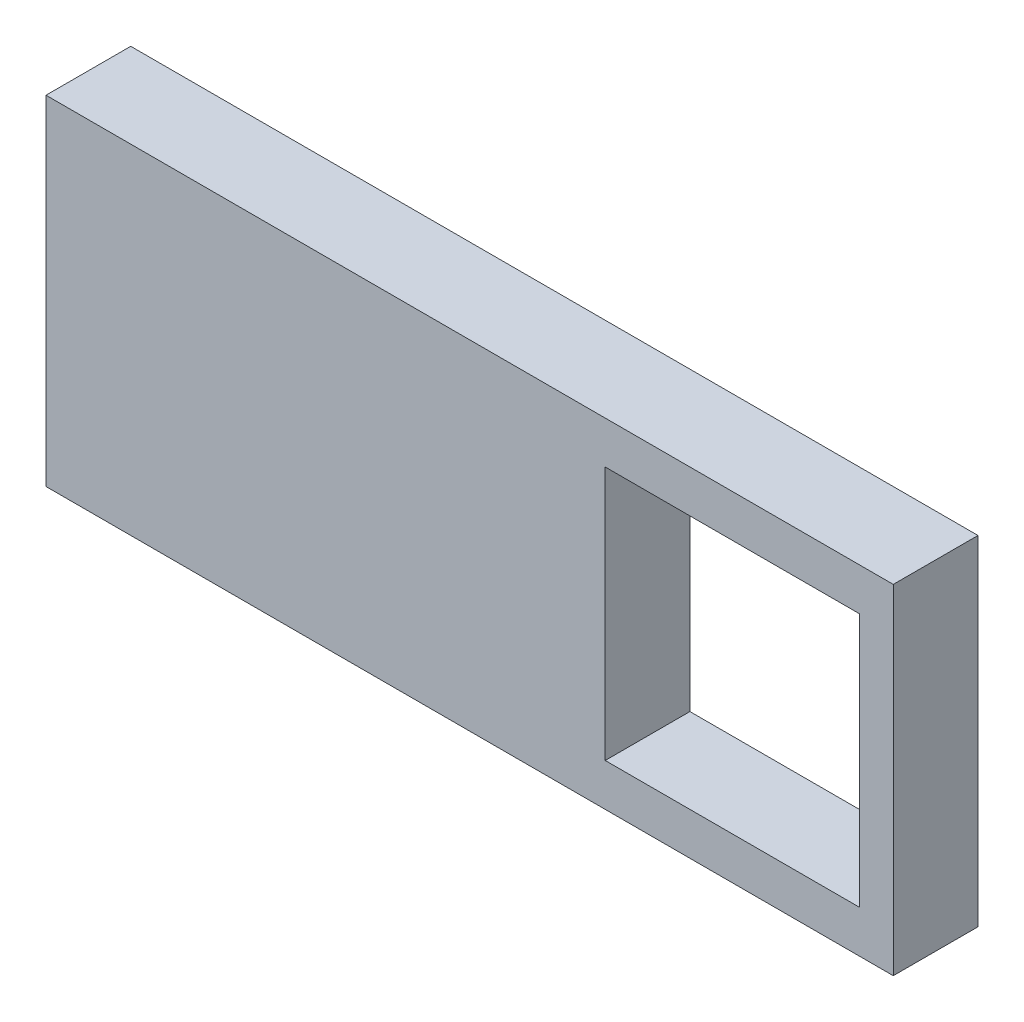
ISO-10303-21;
HEADER;
FILE_DESCRIPTION(('STEP AP214'),'2;1');
FILE_NAME('part.step','',(''),(''),'','','');
FILE_SCHEMA(('AUTOMOTIVE_DESIGN { 1 0 10303 214 1 1 1 1 }'));
ENDSEC;
DATA;
#1=APPLICATION_CONTEXT('core data for automotive mechanical design processes');
#2=APPLICATION_PROTOCOL_DEFINITION('international standard','automotive_design',2000,#1);
#3=PRODUCT_CONTEXT('',#1,'mechanical');
#4=PRODUCT('Part','Part','',(#3));
#5=PRODUCT_RELATED_PRODUCT_CATEGORY('part','',(#4));
#6=PRODUCT_DEFINITION_FORMATION('','',#4);
#7=PRODUCT_DEFINITION_CONTEXT('part definition',#1,'design');
#8=PRODUCT_DEFINITION('design','',#6,#7);
#9=PRODUCT_DEFINITION_SHAPE('','',#8);
#10=(LENGTH_UNIT() NAMED_UNIT(*) SI_UNIT(.MILLI.,.METRE.));
#11=(NAMED_UNIT(*) PLANE_ANGLE_UNIT() SI_UNIT($,.RADIAN.));
#12=(NAMED_UNIT(*) SI_UNIT($,.STERADIAN.) SOLID_ANGLE_UNIT());
#13=UNCERTAINTY_MEASURE_WITH_UNIT(LENGTH_MEASURE(1.E-05),#10,'distance_accuracy_value','');
#14=(GEOMETRIC_REPRESENTATION_CONTEXT(3) GLOBAL_UNCERTAINTY_ASSIGNED_CONTEXT((#13)) GLOBAL_UNIT_ASSIGNED_CONTEXT((#10,
#11,#12)) REPRESENTATION_CONTEXT('',''));
#15=CARTESIAN_POINT('',(0.,0.,0.));
#16=DIRECTION('',(0.,0.,1.));
#17=DIRECTION('',(1.,0.,0.));
#18=AXIS2_PLACEMENT_3D('',#15,#16,#17);
#19=CARTESIAN_POINT('',(-0.06999999832362,-0.07499999832362,0.3));
#20=DIRECTION('',(1.,0.,0.));
#21=DIRECTION('',(0.,1.,0.));
#22=AXIS2_PLACEMENT_3D('',#19,#20,#21);
#23=PLANE('',#22);
#24=DIRECTION('',(0.,1.,0.));
#25=VECTOR('',#24,1.);
#26=CARTESIAN_POINT('',(-0.06999999832362,-0.07499999832362,0.3));
#27=LINE('',#26,#25);
#28=CARTESIAN_POINT('',(-0.06999999832362,-0.07499999832362,0.3));
#29=VERTEX_POINT('',#28);
#30=CARTESIAN_POINT('',(-0.06999999832362,0.07499999832362,0.3));
#31=VERTEX_POINT('',#30);
#32=EDGE_CURVE('E144',#29,#31,#27,.T.);
#33=ORIENTED_EDGE('',*,*,#32,.T.);
#34=DIRECTION('',(0.,0.,1.));
#35=VECTOR('',#34,1.);
#36=CARTESIAN_POINT('',(-0.06999999832362,0.07499999832362,0.3));
#37=LINE('',#36,#35);
#38=CARTESIAN_POINT('',(-0.06999999832362,0.07499999832362,0.35));
#39=VERTEX_POINT('',#38);
#40=EDGE_CURVE('E95',#31,#39,#37,.T.);
#41=ORIENTED_EDGE('',*,*,#40,.T.);
#42=DIRECTION('',(0.,1.,0.));
#43=VECTOR('',#42,1.);
#44=CARTESIAN_POINT('',(-0.06999999832362,-0.07499999832362,0.35));
#45=LINE('',#44,#43);
#46=CARTESIAN_POINT('',(-0.06999999832362,-0.07499999832362,0.35));
#47=VERTEX_POINT('',#46);
#48=EDGE_CURVE('E133',#47,#39,#45,.T.);
#49=ORIENTED_EDGE('',*,*,#48,.F.);
#50=DIRECTION('',(0.,0.,1.));
#51=VECTOR('',#50,1.);
#52=CARTESIAN_POINT('',(-0.06999999832362,-0.07499999832362,0.3));
#53=LINE('',#52,#51);
#54=EDGE_CURVE('E11',#29,#47,#53,.T.);
#55=ORIENTED_EDGE('',*,*,#54,.F.);
#56=EDGE_LOOP('',(#33,#41,#49,#55));
#57=FACE_BOUND('',#56,.T.);
#58=ADVANCED_FACE('F17',(#57),#23,.T.);
#59=CARTESIAN_POINT('',(0.07999999832362,-0.07499999832362,0.3));
#60=DIRECTION('',(0.,1.,0.));
#61=DIRECTION('',(1.,0.,0.));
#62=AXIS2_PLACEMENT_3D('',#59,#60,#61);
#63=PLANE('',#62);
#64=DIRECTION('',(-1.,0.,0.));
#65=VECTOR('',#64,1.);
#66=CARTESIAN_POINT('',(0.07999999832362,-0.07499999832362,0.3));
#67=LINE('',#66,#65);
#68=CARTESIAN_POINT('',(0.07999999832362,-0.07499999832362,0.3));
#69=VERTEX_POINT('',#68);
#70=EDGE_CURVE('E179',#69,#29,#67,.T.);
#71=ORIENTED_EDGE('',*,*,#70,.T.);
#72=ORIENTED_EDGE('',*,*,#54,.T.);
#73=DIRECTION('',(-1.,0.,0.));
#74=VECTOR('',#73,1.);
#75=CARTESIAN_POINT('',(0.07999999832362,-0.07499999832362,0.35));
#76=LINE('',#75,#74);
#77=CARTESIAN_POINT('',(0.07999999832362,-0.07499999832362,0.35));
#78=VERTEX_POINT('',#77);
#79=EDGE_CURVE('E141',#78,#47,#76,.T.);
#80=ORIENTED_EDGE('',*,*,#79,.F.);
#81=DIRECTION('',(0.,0.,1.));
#82=VECTOR('',#81,1.);
#83=CARTESIAN_POINT('',(0.07999999832362,-0.07499999832362,0.3));
#84=LINE('',#83,#82);
#85=EDGE_CURVE('E28',#69,#78,#84,.T.);
#86=ORIENTED_EDGE('',*,*,#85,.F.);
#87=EDGE_LOOP('',(#71,#72,#80,#86));
#88=FACE_BOUND('',#87,.T.);
#89=ADVANCED_FACE('F230',(#88),#63,.T.);
#90=CARTESIAN_POINT('',(0.07999999832362,0.07499999832362,0.3));
#91=DIRECTION('',(-1.,0.,0.));
#92=DIRECTION('',(0.,0.,1.));
#93=AXIS2_PLACEMENT_3D('',#90,#91,#92);
#94=PLANE('',#93);
#95=DIRECTION('',(0.,-1.,0.));
#96=VECTOR('',#95,1.);
#97=CARTESIAN_POINT('',(0.07999999832362,0.07499999832362,0.3));
#98=LINE('',#97,#96);
#99=CARTESIAN_POINT('',(0.07999999832362,0.07499999832362,0.3));
#100=VERTEX_POINT('',#99);
#101=EDGE_CURVE('E156',#100,#69,#98,.T.);
#102=ORIENTED_EDGE('',*,*,#101,.T.);
#103=ORIENTED_EDGE('',*,*,#85,.T.);
#104=DIRECTION('',(0.,-1.,0.));
#105=VECTOR('',#104,1.);
#106=CARTESIAN_POINT('',(0.07999999832362,0.07499999832362,0.35));
#107=LINE('',#106,#105);
#108=CARTESIAN_POINT('',(0.07999999832362,0.07499999832362,0.35));
#109=VERTEX_POINT('',#108);
#110=EDGE_CURVE('E162',#109,#78,#107,.T.);
#111=ORIENTED_EDGE('',*,*,#110,.F.);
#112=DIRECTION('',(0.,0.,1.));
#113=VECTOR('',#112,1.);
#114=CARTESIAN_POINT('',(0.07999999832362,0.07499999832362,0.3));
#115=LINE('',#114,#113);
#116=EDGE_CURVE('E150',#100,#109,#115,.T.);
#117=ORIENTED_EDGE('',*,*,#116,.F.);
#118=EDGE_LOOP('',(#102,#103,#111,#117));
#119=FACE_BOUND('',#118,.T.);
#120=ADVANCED_FACE('F236',(#119),#94,.T.);
#121=CARTESIAN_POINT('',(-0.06999999832362,0.07499999832362,0.3));
#122=DIRECTION('',(0.,-1.,0.));
#123=DIRECTION('',(-1.,0.,0.));
#124=AXIS2_PLACEMENT_3D('',#121,#122,#123);
#125=PLANE('',#124);
#126=DIRECTION('',(1.,0.,0.));
#127=VECTOR('',#126,1.);
#128=CARTESIAN_POINT('',(-0.06999999832362,0.07499999832362,0.3));
#129=LINE('',#128,#127);
#130=EDGE_CURVE('E163',#31,#100,#129,.T.);
#131=ORIENTED_EDGE('',*,*,#130,.T.);
#132=ORIENTED_EDGE('',*,*,#116,.T.);
#133=DIRECTION('',(1.,0.,0.));
#134=VECTOR('',#133,1.);
#135=CARTESIAN_POINT('',(-0.06999999832362,0.07499999832362,0.35));
#136=LINE('',#135,#134);
#137=EDGE_CURVE('E171',#39,#109,#136,.T.);
#138=ORIENTED_EDGE('',*,*,#137,.F.);
#139=ORIENTED_EDGE('',*,*,#40,.F.);
#140=EDGE_LOOP('',(#131,#132,#138,#139));
#141=FACE_BOUND('',#140,.T.);
#142=ADVANCED_FACE('F195',(#141),#125,.T.);
#143=CARTESIAN_POINT('',(-0.399999988824,0.09999999776483,0.3));
#144=DIRECTION('',(-1.,0.,0.));
#145=DIRECTION('',(0.,0.,1.));
#146=AXIS2_PLACEMENT_3D('',#143,#144,#145);
#147=PLANE('',#146);
#148=DIRECTION('',(0.,1.,0.));
#149=VECTOR('',#148,1.);
#150=CARTESIAN_POINT('',(-0.399999988824,-0.09999999776483,0.3));
#151=LINE('',#150,#149);
#152=CARTESIAN_POINT('',(-0.399999988824,-0.09999999776483,0.3));
#153=VERTEX_POINT('',#152);
#154=CARTESIAN_POINT('',(-0.399999988824,0.09999999776483,0.3));
#155=VERTEX_POINT('',#154);
#156=EDGE_CURVE('E112',#153,#155,#151,.T.);
#157=ORIENTED_EDGE('',*,*,#156,.F.);
#158=DIRECTION('',(0.,0.,1.));
#159=VECTOR('',#158,1.);
#160=CARTESIAN_POINT('',(-0.399999988824,-0.09999999776483,0.3));
#161=LINE('',#160,#159);
#162=CARTESIAN_POINT('',(-0.399999988824,-0.09999999776483,0.35));
#163=VERTEX_POINT('',#162);
#164=EDGE_CURVE('E107',#153,#163,#161,.T.);
#165=ORIENTED_EDGE('',*,*,#164,.T.);
#166=DIRECTION('',(0.,-1.,0.));
#167=VECTOR('',#166,1.);
#168=CARTESIAN_POINT('',(-0.399999988824,-0.09999999776483,0.35));
#169=LINE('',#168,#167);
#170=CARTESIAN_POINT('',(-0.399999988824,0.09999999776483,0.35));
#171=VERTEX_POINT('',#170);
#172=EDGE_CURVE('E109',#171,#163,#169,.T.);
#173=ORIENTED_EDGE('',*,*,#172,.F.);
#174=DIRECTION('',(0.,0.,1.));
#175=VECTOR('',#174,1.);
#176=CARTESIAN_POINT('',(-0.399999988824,0.09999999776483,0.3));
#177=LINE('',#176,#175);
#178=EDGE_CURVE('E21',#155,#171,#177,.T.);
#179=ORIENTED_EDGE('',*,*,#178,.F.);
#180=EDGE_LOOP('',(#157,#165,#173,#179));
#181=FACE_BOUND('',#180,.T.);
#182=ADVANCED_FACE('F19',(#181),#147,.T.);
#183=CARTESIAN_POINT('',(0.1,0.09999999776483,0.3));
#184=DIRECTION('',(0.,1.,0.));
#185=DIRECTION('',(1.,0.,0.));
#186=AXIS2_PLACEMENT_3D('',#183,#184,#185);
#187=PLANE('',#186);
#188=DIRECTION('',(1.,0.,0.));
#189=VECTOR('',#188,1.);
#190=CARTESIAN_POINT('',(-0.399999988824,0.09999999776483,0.3));
#191=LINE('',#190,#189);
#192=CARTESIAN_POINT('',(0.1,0.09999999776483,0.3));
#193=VERTEX_POINT('',#192);
#194=EDGE_CURVE('E172',#155,#193,#191,.T.);
#195=ORIENTED_EDGE('',*,*,#194,.F.);
#196=ORIENTED_EDGE('',*,*,#178,.T.);
#197=DIRECTION('',(-1.,0.,0.));
#198=VECTOR('',#197,1.);
#199=CARTESIAN_POINT('',(-0.399999988824,0.09999999776483,0.35));
#200=LINE('',#199,#198);
#201=CARTESIAN_POINT('',(0.1,0.09999999776483,0.35));
#202=VERTEX_POINT('',#201);
#203=EDGE_CURVE('E126',#202,#171,#200,.T.);
#204=ORIENTED_EDGE('',*,*,#203,.F.);
#205=DIRECTION('',(0.,0.,1.));
#206=VECTOR('',#205,1.);
#207=CARTESIAN_POINT('',(0.1,0.09999999776483,0.3));
#208=LINE('',#207,#206);
#209=EDGE_CURVE('E86',#193,#202,#208,.T.);
#210=ORIENTED_EDGE('',*,*,#209,.F.);
#211=EDGE_LOOP('',(#195,#196,#204,#210));
#212=FACE_BOUND('',#211,.T.);
#213=ADVANCED_FACE('F216',(#212),#187,.T.);
#214=CARTESIAN_POINT('',(0.1,-0.09999999776483,0.3));
#215=DIRECTION('',(1.,0.,0.));
#216=DIRECTION('',(0.,1.,0.));
#217=AXIS2_PLACEMENT_3D('',#214,#215,#216);
#218=PLANE('',#217);
#219=DIRECTION('',(0.,-1.,0.));
#220=VECTOR('',#219,1.);
#221=CARTESIAN_POINT('',(0.1,0.09999999776483,0.3));
#222=LINE('',#221,#220);
#223=CARTESIAN_POINT('',(0.1,-0.09999999776483,0.3));
#224=VERTEX_POINT('',#223);
#225=EDGE_CURVE('E167',#193,#224,#222,.T.);
#226=ORIENTED_EDGE('',*,*,#225,.F.);
#227=ORIENTED_EDGE('',*,*,#209,.T.);
#228=DIRECTION('',(0.,1.,0.));
#229=VECTOR('',#228,1.);
#230=CARTESIAN_POINT('',(0.1,0.09999999776483,0.35));
#231=LINE('',#230,#229);
#232=CARTESIAN_POINT('',(0.1,-0.09999999776483,0.35));
#233=VERTEX_POINT('',#232);
#234=EDGE_CURVE('E132',#233,#202,#231,.T.);
#235=ORIENTED_EDGE('',*,*,#234,.F.);
#236=DIRECTION('',(0.,0.,1.));
#237=VECTOR('',#236,1.);
#238=CARTESIAN_POINT('',(0.1,-0.09999999776483,0.3));
#239=LINE('',#238,#237);
#240=EDGE_CURVE('E118',#224,#233,#239,.T.);
#241=ORIENTED_EDGE('',*,*,#240,.F.);
#242=EDGE_LOOP('',(#226,#227,#235,#241));
#243=FACE_BOUND('',#242,.T.);
#244=ADVANCED_FACE('F218',(#243),#218,.T.);
#245=CARTESIAN_POINT('',(-0.399999988824,-0.09999999776483,0.3));
#246=DIRECTION('',(0.,-1.,0.));
#247=DIRECTION('',(0.,0.,-1.));
#248=AXIS2_PLACEMENT_3D('',#245,#246,#247);
#249=PLANE('',#248);
#250=DIRECTION('',(-1.,0.,0.));
#251=VECTOR('',#250,1.);
#252=CARTESIAN_POINT('',(0.1,-0.09999999776483,0.3));
#253=LINE('',#252,#251);
#254=EDGE_CURVE('E153',#224,#153,#253,.T.);
#255=ORIENTED_EDGE('',*,*,#254,.F.);
#256=ORIENTED_EDGE('',*,*,#240,.T.);
#257=DIRECTION('',(1.,0.,0.));
#258=VECTOR('',#257,1.);
#259=CARTESIAN_POINT('',(0.1,-0.09999999776483,0.35));
#260=LINE('',#259,#258);
#261=EDGE_CURVE('E125',#163,#233,#260,.T.);
#262=ORIENTED_EDGE('',*,*,#261,.F.);
#263=ORIENTED_EDGE('',*,*,#164,.F.);
#264=EDGE_LOOP('',(#255,#256,#262,#263));
#265=FACE_BOUND('',#264,.T.);
#266=ADVANCED_FACE('F129',(#265),#249,.T.);
#267=CARTESIAN_POINT('',(-0.149999994412,0.,0.35));
#268=DIRECTION('',(0.,0.,1.));
#269=DIRECTION('',(1.,0.,0.));
#270=AXIS2_PLACEMENT_3D('',#267,#268,#269);
#271=PLANE('',#270);
#272=ORIENTED_EDGE('',*,*,#261,.T.);
#273=ORIENTED_EDGE('',*,*,#234,.T.);
#274=ORIENTED_EDGE('',*,*,#203,.T.);
#275=ORIENTED_EDGE('',*,*,#172,.T.);
#276=EDGE_LOOP('',(#272,#273,#274,#275));
#277=FACE_BOUND('',#276,.T.);
#278=ORIENTED_EDGE('',*,*,#137,.T.);
#279=ORIENTED_EDGE('',*,*,#110,.T.);
#280=ORIENTED_EDGE('',*,*,#79,.T.);
#281=ORIENTED_EDGE('',*,*,#48,.T.);
#282=EDGE_LOOP('',(#278,#279,#280,#281));
#283=FACE_BOUND('',#282,.T.);
#284=ADVANCED_FACE('F122',(#277,#283),#271,.T.);
#285=CARTESIAN_POINT('',(-0.149999994412,0.,0.3));
#286=DIRECTION('',(0.,0.,1.));
#287=DIRECTION('',(1.,0.,0.));
#288=AXIS2_PLACEMENT_3D('',#285,#286,#287);
#289=PLANE('',#288);
#290=ORIENTED_EDGE('',*,*,#254,.T.);
#291=ORIENTED_EDGE('',*,*,#156,.T.);
#292=ORIENTED_EDGE('',*,*,#194,.T.);
#293=ORIENTED_EDGE('',*,*,#225,.T.);
#294=EDGE_LOOP('',(#290,#291,#292,#293));
#295=FACE_BOUND('',#294,.T.);
#296=ORIENTED_EDGE('',*,*,#130,.F.);
#297=ORIENTED_EDGE('',*,*,#32,.F.);
#298=ORIENTED_EDGE('',*,*,#70,.F.);
#299=ORIENTED_EDGE('',*,*,#101,.F.);
#300=EDGE_LOOP('',(#296,#297,#298,#299));
#301=FACE_BOUND('',#300,.T.);
#302=ADVANCED_FACE('F193',(#295,#301),#289,.F.);
#303=CLOSED_SHELL('',(#58,#89,#120,#142,#182,#213,#244,#266,#284,#302));
#304=MANIFOLD_SOLID_BREP('B1',#303);
#305=ADVANCED_BREP_SHAPE_REPRESENTATION('',(#18,#304),#14);
#306=SHAPE_DEFINITION_REPRESENTATION(#9,#305);
ENDSEC;
END-ISO-10303-21;
